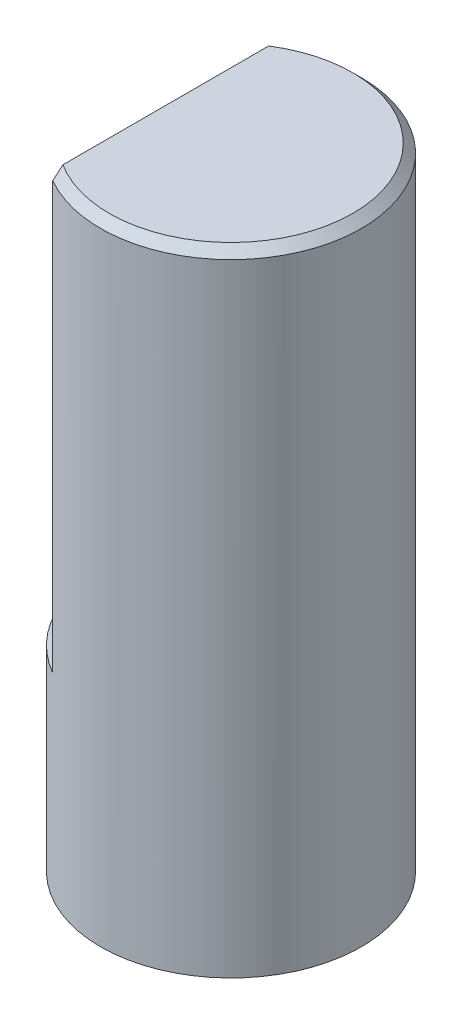
ISO-10303-21;
HEADER;
FILE_DESCRIPTION(('STEP AP214'),'2;1');
FILE_NAME('part.step','',(''),(''),'','','');
FILE_SCHEMA(('AUTOMOTIVE_DESIGN { 1 0 10303 214 1 1 1 1 }'));
ENDSEC;
DATA;
#1=APPLICATION_CONTEXT('core data for automotive mechanical design processes');
#2=APPLICATION_PROTOCOL_DEFINITION('international standard','automotive_design',2000,#1);
#3=PRODUCT_CONTEXT('',#1,'mechanical');
#4=PRODUCT('Part','Part','',(#3));
#5=PRODUCT_RELATED_PRODUCT_CATEGORY('part','',(#4));
#6=PRODUCT_DEFINITION_FORMATION('','',#4);
#7=PRODUCT_DEFINITION_CONTEXT('part definition',#1,'design');
#8=PRODUCT_DEFINITION('design','',#6,#7);
#9=PRODUCT_DEFINITION_SHAPE('','',#8);
#10=(LENGTH_UNIT() NAMED_UNIT(*) SI_UNIT(.MILLI.,.METRE.));
#11=(NAMED_UNIT(*) PLANE_ANGLE_UNIT() SI_UNIT($,.RADIAN.));
#12=(NAMED_UNIT(*) SI_UNIT($,.STERADIAN.) SOLID_ANGLE_UNIT());
#13=UNCERTAINTY_MEASURE_WITH_UNIT(LENGTH_MEASURE(1.E-05),#10,'distance_accuracy_value','');
#14=(GEOMETRIC_REPRESENTATION_CONTEXT(3) GLOBAL_UNCERTAINTY_ASSIGNED_CONTEXT((#13)) GLOBAL_UNIT_ASSIGNED_CONTEXT((#10,
#11,#12)) REPRESENTATION_CONTEXT('',''));
#15=CARTESIAN_POINT('',(0.,0.,0.));
#16=DIRECTION('',(0.,0.,1.));
#17=DIRECTION('',(1.,0.,0.));
#18=AXIS2_PLACEMENT_3D('',#15,#16,#17);
#19=CARTESIAN_POINT('',(0.,0.,0.));
#20=DIRECTION('',(0.,-1.,0.));
#21=DIRECTION('',(0.,0.,-1.));
#22=AXIS2_PLACEMENT_3D('',#19,#20,#21);
#23=PLANE('',#22);
#24=CARTESIAN_POINT('',(0.,0.,0.));
#25=DIRECTION('',(0.,-1.,0.));
#26=DIRECTION('',(0.,0.,-1.));
#27=AXIS2_PLACEMENT_3D('',#24,#25,#26);
#28=CIRCLE('',#27,2.);
#29=CARTESIAN_POINT('',(0.,0.,-2.));
#30=VERTEX_POINT('',#29);
#31=EDGE_CURVE('E19',#30,#30,#28,.F.);
#32=ORIENTED_EDGE('',*,*,#31,.F.);
#33=EDGE_LOOP('',(#32));
#34=FACE_BOUND('',#33,.T.);
#35=ADVANCED_FACE('F16',(#34),#23,.T.);
#36=CARTESIAN_POINT('',(0.,15.75,0.));
#37=DIRECTION('',(0.,-1.,0.));
#38=DIRECTION('',(0.,0.,-1.));
#39=AXIS2_PLACEMENT_3D('',#36,#37,#38);
#40=CYLINDRICAL_SURFACE('',#39,2.);
#41=CARTESIAN_POINT('',(0.,0.5,0.));
#42=DIRECTION('',(0.,-1.,0.));
#43=DIRECTION('',(0.,0.,-1.));
#44=AXIS2_PLACEMENT_3D('',#41,#42,#43);
#45=CIRCLE('',#44,2.);
#46=CARTESIAN_POINT('',(0.,0.5,-2.));
#47=VERTEX_POINT('',#46);
#48=EDGE_CURVE('E61',#47,#47,#45,.F.);
#49=ORIENTED_EDGE('',*,*,#48,.F.);
#50=EDGE_LOOP('',(#49));
#51=FACE_BOUND('',#50,.T.);
#52=ORIENTED_EDGE('',*,*,#31,.T.);
#53=EDGE_LOOP('',(#52));
#54=FACE_BOUND('',#53,.T.);
#55=ADVANCED_FACE('F115',(#51,#54),#40,.T.);
#56=CARTESIAN_POINT('',(0.,15.,0.));
#57=DIRECTION('',(0.,-1.,0.));
#58=DIRECTION('',(0.,0.,-1.));
#59=AXIS2_PLACEMENT_3D('',#56,#57,#58);
#60=PLANE('',#59);
#61=CARTESIAN_POINT('',(0.,15.,0.));
#62=DIRECTION('',(0.,-1.,0.));
#63=DIRECTION('',(0.,0.,-1.));
#64=AXIS2_PLACEMENT_3D('',#61,#62,#63);
#65=CIRCLE('',#64,2.79997889573219);
#66=CARTESIAN_POINT('',(-1.4999974648518,14.999993686253,-2.36431198349364));
#67=VERTEX_POINT('',#66);
#68=CARTESIAN_POINT('',(-1.49999745786962,14.9999936951973,2.36431196903266));
#69=VERTEX_POINT('',#68);
#70=EDGE_CURVE('E66',#67,#69,#65,.T.);
#71=ORIENTED_EDGE('',*,*,#70,.F.);
#72=DIRECTION('',(0.,0.,-1.));
#73=VECTOR('',#72,1.);
#74=CARTESIAN_POINT('',(-1.5,14.99999645189,2.598076211353));
#75=LINE('',#74,#73);
#76=EDGE_CURVE('E64',#67,#69,#75,.F.);
#77=ORIENTED_EDGE('',*,*,#76,.T.);
#78=EDGE_LOOP('',(#71,#77));
#79=FACE_BOUND('',#78,.T.);
#80=ADVANCED_FACE('F113',(#79),#60,.F.);
#81=CARTESIAN_POINT('',(-1.5,15.,2.598076211353));
#82=DIRECTION('',(1.,0.,0.));
#83=DIRECTION('',(0.,0.,-1.));
#84=AXIS2_PLACEMENT_3D('',#81,#82,#83);
#85=PLANE('',#84);
#86=DIRECTION('',(0.,0.,1.));
#87=VECTOR('',#86,1.);
#88=CARTESIAN_POINT('',(-1.5,5.,0.));
#89=LINE('',#88,#87);
#90=CARTESIAN_POINT('',(-1.50000000005932,5.,2.59807621131907));
#91=VERTEX_POINT('',#90);
#92=CARTESIAN_POINT('',(-1.50000000000007,5.,-2.59807621135328));
#93=VERTEX_POINT('',#92);
#94=EDGE_CURVE('E33',#91,#93,#89,.F.);
#95=ORIENTED_EDGE('',*,*,#94,.F.);
#96=DIRECTION('',(0.,-1.,0.));
#97=VECTOR('',#96,1.);
#98=CARTESIAN_POINT('',(-1.50000000011864,15.75,2.59807621128482));
#99=LINE('',#98,#97);
#100=CARTESIAN_POINT('',(-1.49999809522148,14.7999920025719,2.59807113633989));
#101=VERTEX_POINT('',#100);
#102=EDGE_CURVE('E68',#101,#91,#99,.T.);
#103=ORIENTED_EDGE('',*,*,#102,.F.);
#104=CARTESIAN_POINT('',(-1.5,14.9999880697351,2.36430721886254));
#105=CARTESIAN_POINT('',(-1.5,14.9668973504154,2.40347490171618));
#106=CARTESIAN_POINT('',(-1.5,14.9336851595644,2.4425386546572));
#107=CARTESIAN_POINT('',(-1.5,14.8670178571524,2.52045827458885));
#108=CARTESIAN_POINT('',(-1.5,14.8335627457543,2.55931414171888));
#109=CARTESIAN_POINT('',(-1.5,14.7999861629879,2.59806607907566));
#110=B_SPLINE_CURVE_WITH_KNOTS('',3,(#104,#105,#106,#107,#108,#109),.UNSPECIFIED.,.F.,.F.,(4,2,
4),(0.,0.153822097679803,0.307644092211681),.UNSPECIFIED.);
#111=EDGE_CURVE('E54',#69,#101,#110,.T.);
#112=ORIENTED_EDGE('',*,*,#111,.F.);
#113=ORIENTED_EDGE('',*,*,#76,.F.);
#114=CARTESIAN_POINT('',(-1.5,14.799985952225,-2.59806632244245));
#115=CARTESIAN_POINT('',(-1.5,14.8335625687593,-2.55931434705353));
#116=CARTESIAN_POINT('',(-1.5,14.8670177137006,-2.52045844169779));
#117=CARTESIAN_POINT('',(-1.5,14.9336850827497,-2.44253874492742));
#118=CARTESIAN_POINT('',(-1.5,14.9668973066947,-2.40347495337341));
#119=CARTESIAN_POINT('',(-1.5,14.9999880588837,-2.36430723171318));
#120=B_SPLINE_CURVE_WITH_KNOTS('',3,(#114,#115,#116,#117,#118,#119),.UNSPECIFIED.,.F.,.F.,(4,2,
4),(0.,0.153822147093677,0.307644397335661),.UNSPECIFIED.);
#121=CARTESIAN_POINT('',(-1.49999799009983,14.7999916909361,-2.59807129234774));
#122=VERTEX_POINT('',#121);
#123=EDGE_CURVE('E52',#122,#67,#120,.T.);
#124=ORIENTED_EDGE('',*,*,#123,.F.);
#125=DIRECTION('',(0.,-1.,0.));
#126=VECTOR('',#125,1.);
#127=CARTESIAN_POINT('',(-1.50000000000014,15.75,-2.59807621135324));
#128=LINE('',#127,#126);
#129=EDGE_CURVE('E58',#93,#122,#128,.F.);
#130=ORIENTED_EDGE('',*,*,#129,.F.);
#131=EDGE_LOOP('',(#95,#103,#112,#113,#124,#130));
#132=FACE_BOUND('',#131,.T.);
#133=ADVANCED_FACE('F63',(#132),#85,.F.);
#134=CARTESIAN_POINT('',(0.,5.,0.));
#135=DIRECTION('',(0.,1.,0.));
#136=DIRECTION('',(0.,0.,1.));
#137=AXIS2_PLACEMENT_3D('',#134,#135,#136);
#138=PLANE('',#137);
#139=ORIENTED_EDGE('',*,*,#94,.T.);
#140=CARTESIAN_POINT('',(0.,5.,0.));
#141=DIRECTION('',(0.,-1.,0.));
#142=DIRECTION('',(0.,0.,-1.));
#143=AXIS2_PLACEMENT_3D('',#140,#141,#142);
#144=CIRCLE('',#143,3.);
#145=EDGE_CURVE('E60',#91,#93,#144,.T.);
#146=ORIENTED_EDGE('',*,*,#145,.F.);
#147=EDGE_LOOP('',(#139,#146));
#148=FACE_BOUND('',#147,.T.);
#149=ADVANCED_FACE('F121',(#148),#138,.T.);
#150=CARTESIAN_POINT('',(0.,0.5,0.));
#151=DIRECTION('',(0.,-1.,0.));
#152=DIRECTION('',(0.,0.,-1.));
#153=AXIS2_PLACEMENT_3D('',#150,#151,#152);
#154=PLANE('',#153);
#155=ORIENTED_EDGE('',*,*,#48,.T.);
#156=EDGE_LOOP('',(#155));
#157=FACE_BOUND('',#156,.T.);
#158=CARTESIAN_POINT('',(0.,0.5,0.));
#159=DIRECTION('',(0.,-1.,0.));
#160=DIRECTION('',(0.,0.,-1.));
#161=AXIS2_PLACEMENT_3D('',#158,#159,#160);
#162=CIRCLE('',#161,3.);
#163=CARTESIAN_POINT('',(0.,0.5,-3.));
#164=VERTEX_POINT('',#163);
#165=EDGE_CURVE('E25',#164,#164,#162,.F.);
#166=ORIENTED_EDGE('',*,*,#165,.F.);
#167=EDGE_LOOP('',(#166));
#168=FACE_BOUND('',#167,.T.);
#169=ADVANCED_FACE('F88',(#157,#168),#154,.T.);
#170=CARTESIAN_POINT('',(0.,14.7987772162992,0.));
#171=DIRECTION('',(0.,-1.,0.));
#172=DIRECTION('',(1.,0.,0.));
#173=AXIS2_PLACEMENT_3D('',#170,#171,#172);
#174=CONICAL_SURFACE('',#173,3.00120016277106,0.78539439476937);
#175=ORIENTED_EDGE('',*,*,#123,.T.);
#176=ORIENTED_EDGE('',*,*,#70,.T.);
#177=ORIENTED_EDGE('',*,*,#111,.T.);
#178=CARTESIAN_POINT('',(0.,14.7999773881162,0.));
#179=DIRECTION('',(0.,-1.,0.));
#180=DIRECTION('',(1.,0.,0.));
#181=AXIS2_PLACEMENT_3D('',#178,#179,#180);
#182=CIRCLE('',#181,3.);
#183=EDGE_CURVE('E10',#122,#101,#182,.T.);
#184=ORIENTED_EDGE('',*,*,#183,.F.);
#185=EDGE_LOOP('',(#175,#176,#177,#184));
#186=FACE_BOUND('',#185,.T.);
#187=ADVANCED_FACE('F49',(#186),#174,.T.);
#188=CARTESIAN_POINT('',(0.,15.75,0.));
#189=DIRECTION('',(0.,-1.,0.));
#190=DIRECTION('',(0.,0.,-1.));
#191=AXIS2_PLACEMENT_3D('',#188,#189,#190);
#192=CYLINDRICAL_SURFACE('',#191,3.);
#193=ORIENTED_EDGE('',*,*,#165,.T.);
#194=EDGE_LOOP('',(#193));
#195=FACE_BOUND('',#194,.T.);
#196=ORIENTED_EDGE('',*,*,#145,.T.);
#197=ORIENTED_EDGE('',*,*,#129,.T.);
#198=ORIENTED_EDGE('',*,*,#183,.T.);
#199=ORIENTED_EDGE('',*,*,#102,.T.);
#200=EDGE_LOOP('',(#196,#197,#198,#199));
#201=FACE_BOUND('',#200,.T.);
#202=ADVANCED_FACE('F59',(#195,#201),#192,.T.);
#203=CLOSED_SHELL('',(#35,#55,#80,#133,#149,#169,#187,#202));
#204=MANIFOLD_SOLID_BREP('B1',#203);
#205=ADVANCED_BREP_SHAPE_REPRESENTATION('',(#18,#204),#14);
#206=SHAPE_DEFINITION_REPRESENTATION(#9,#205);
ENDSEC;
END-ISO-10303-21;
